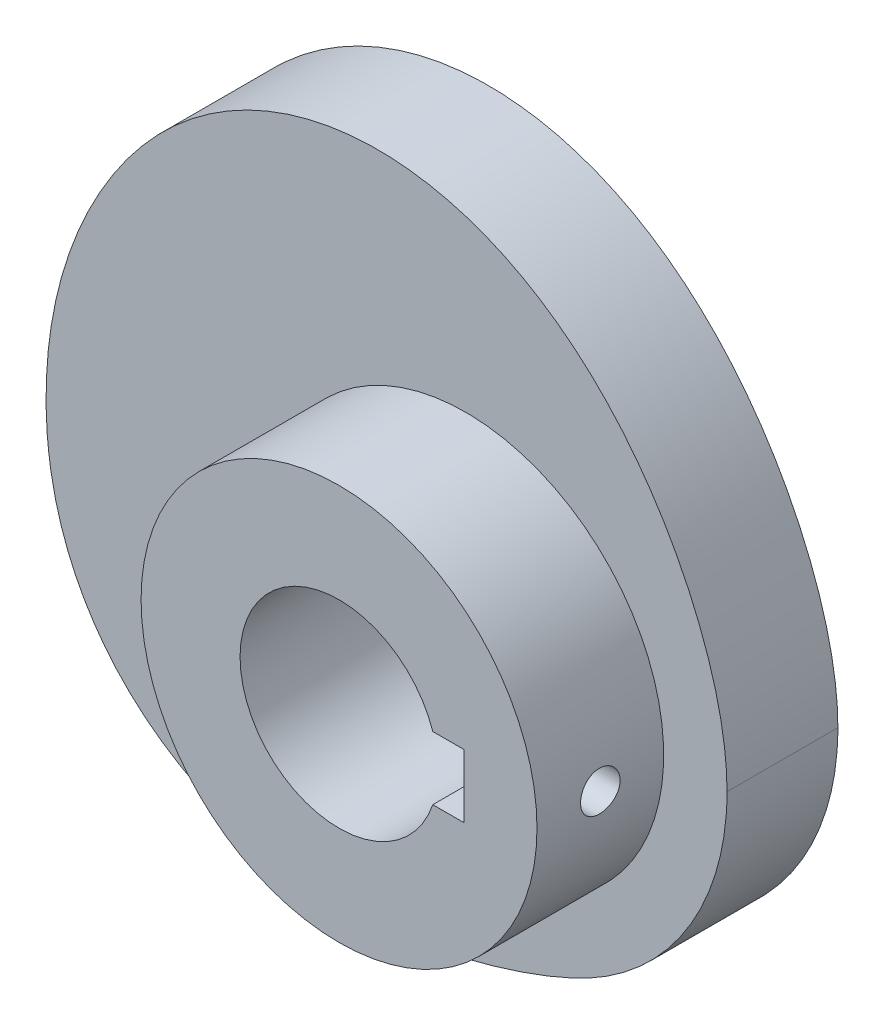
ISO-10303-21;
HEADER;
FILE_DESCRIPTION(('STEP AP214'),'2;1');
FILE_NAME('part.step','',(''),(''),'','','');
FILE_SCHEMA(('AUTOMOTIVE_DESIGN { 1 0 10303 214 1 1 1 1 }'));
ENDSEC;
DATA;
#1=APPLICATION_CONTEXT('core data for automotive mechanical design processes');
#2=APPLICATION_PROTOCOL_DEFINITION('international standard','automotive_design',2000,#1);
#3=PRODUCT_CONTEXT('',#1,'mechanical');
#4=PRODUCT('Part','Part','',(#3));
#5=PRODUCT_RELATED_PRODUCT_CATEGORY('part','',(#4));
#6=PRODUCT_DEFINITION_FORMATION('','',#4);
#7=PRODUCT_DEFINITION_CONTEXT('part definition',#1,'design');
#8=PRODUCT_DEFINITION('design','',#6,#7);
#9=PRODUCT_DEFINITION_SHAPE('','',#8);
#10=(LENGTH_UNIT() NAMED_UNIT(*) SI_UNIT(.MILLI.,.METRE.));
#11=(NAMED_UNIT(*) PLANE_ANGLE_UNIT() SI_UNIT($,.RADIAN.));
#12=(NAMED_UNIT(*) SI_UNIT($,.STERADIAN.) SOLID_ANGLE_UNIT());
#13=UNCERTAINTY_MEASURE_WITH_UNIT(LENGTH_MEASURE(1.E-05),#10,'distance_accuracy_value','');
#14=(GEOMETRIC_REPRESENTATION_CONTEXT(3) GLOBAL_UNCERTAINTY_ASSIGNED_CONTEXT((#13)) GLOBAL_UNIT_ASSIGNED_CONTEXT((#10,
#11,#12)) REPRESENTATION_CONTEXT('',''));
#15=CARTESIAN_POINT('',(0.,0.,0.));
#16=DIRECTION('',(0.,0.,1.));
#17=DIRECTION('',(1.,0.,0.));
#18=AXIS2_PLACEMENT_3D('',#15,#16,#17);
#19=CARTESIAN_POINT('',(-7.3709605697285,-36.2111945327901,0.));
#20=DIRECTION('',(0.,0.,-1.));
#21=DIRECTION('',(-1.,0.,0.));
#22=AXIS2_PLACEMENT_3D('',#19,#20,#21);
#23=PLANE('',#22);
#24=CARTESIAN_POINT('',(-52.399929,-7.544148,0.));
#25=CARTESIAN_POINT('',(-52.2514475105252,-8.34444993274773,0.));
#26=CARTESIAN_POINT('',(-51.9564778908329,-9.93430977033862,0.));
#27=CARTESIAN_POINT('',(-51.4313788468868,-11.8813277428217,0.));
#28=CARTESIAN_POINT('',(-50.9466154916934,-13.4023526014832,0.));
#29=CARTESIAN_POINT('',(-50.5477748516514,-14.5208330980917,0.));
#30=CARTESIAN_POINT('',(-50.1139687547772,-15.6197210397756,0.));
#31=CARTESIAN_POINT('',(-49.6452109087246,-16.6981580375907,0.));
#32=CARTESIAN_POINT('',(-49.1419760694463,-17.7553100378557,0.));
#33=CARTESIAN_POINT('',(-48.604716765922,-18.7903201751489,0.));
#34=CARTESIAN_POINT('',(-48.0339937159755,-19.8023333896151,0.));
#35=CARTESIAN_POINT('',(-47.4304346872806,-20.790495874816,0.));
#36=CARTESIAN_POINT('',(-46.7947376459225,-21.753963168475,0.));
#37=CARTESIAN_POINT('',(-46.1276814352763,-22.6919050329283,0.));
#38=CARTESIAN_POINT('',(-45.4300911184589,-23.6035271118136,0.));
#39=CARTESIAN_POINT('',(-44.4616904607917,-24.7814267497654,0.));
#40=CARTESIAN_POINT('',(-43.1792408584717,-26.1849802534775,0.));
#41=CARTESIAN_POINT('',(-41.5325691306829,-27.7538647036069,0.));
#42=CARTESIAN_POINT('',(-39.7889364746683,-29.2010855332149,0.));
#43=CARTESIAN_POINT('',(-37.9582781497699,-30.5228757176791,0.));
#44=CARTESIAN_POINT('',(-36.0509365120843,-31.7165854933599,0.));
#45=CARTESIAN_POINT('',(-34.0775534876366,-32.780697634572,0.));
#46=CARTESIAN_POINT('',(-32.0488345275358,-33.7148861607282,0.));
#47=CARTESIAN_POINT('',(-29.9753507062401,-34.5200367758683,0.));
#48=CARTESIAN_POINT('',(-27.8673264161743,-35.1982234795106,0.));
#49=CARTESIAN_POINT('',(-25.734442746563,-35.7526536333091,0.));
#50=CARTESIAN_POINT('',(-23.5856591141531,-36.1875740885093,0.));
#51=CARTESIAN_POINT('',(-21.4290633552693,-36.5081496797175,0.));
#52=CARTESIAN_POINT('',(-19.2717600199635,-36.7203102461087,0.));
#53=CARTESIAN_POINT('',(-17.1198042458267,-36.8305950850238,0.));
#54=CARTESIAN_POINT('',(-14.9781860025853,-36.8459709492699,0.));
#55=CARTESIAN_POINT('',(-12.8508731130897,-36.7736547047701,0.));
#56=CARTESIAN_POINT('',(-10.7409136872376,-36.6209379222022,0.));
#57=CARTESIAN_POINT('',(-8.65059787497186,-36.3950225263771,0.));
#58=CARTESIAN_POINT('',(-6.58167452531198,-36.1028634074745,0.));
#59=CARTESIAN_POINT('',(-4.53561116103457,-35.7510269365169,0.));
#60=CARTESIAN_POINT('',(-2.51388778578776,-35.3455562085219,0.));
#61=CARTESIAN_POINT('',(-0.518293787750499,-34.8918561153713,0.));
#62=CARTESIAN_POINT('',(1.44878186282285,-34.3945747382762,0.));
#63=CARTESIAN_POINT('',(3.38410573816377,-33.8575306418036,0.));
#64=CARTESIAN_POINT('',(5.28339500359813,-33.2836372077604,0.));
#65=CARTESIAN_POINT('',(7.14118101365087,-32.6749149201344,0.));
#66=CARTESIAN_POINT('',(8.95071741622066,-32.032560930042,0.));
#67=CARTESIAN_POINT('',(10.7039161524053,-31.3571159996698,0.));
#68=CARTESIAN_POINT('',(12.3913317007457,-30.6488176191115,0.));
#69=CARTESIAN_POINT('',(14.0020489834808,-29.9079007921815,0.));
#70=CARTESIAN_POINT('',(15.5253407930936,-29.1349726367089,0.));
#71=CARTESIAN_POINT('',(16.9672037514807,-28.3198205671357,0.));
#72=CARTESIAN_POINT('',(18.3411570367744,-27.4494701693589,0.));
#73=CARTESIAN_POINT('',(19.6659802564212,-26.5165088193859,0.));
#74=CARTESIAN_POINT('',(20.9433852447628,-25.5195875695659,0.));
#75=CARTESIAN_POINT('',(22.1703480278543,-24.4612098855664,0.));
#76=CARTESIAN_POINT('',(23.3438967409941,-23.3438966213059,0.));
#77=CARTESIAN_POINT('',(24.4612089941291,-22.1703476151702,0.));
#78=CARTESIAN_POINT('',(25.519591015629,-20.9433870151886,0.));
#79=CARTESIAN_POINT('',(26.5164959265808,-19.6659735874071,0.));
#80=CARTESIAN_POINT('',(27.4495182945047,-18.3411819423989,0.));
#81=CARTESIAN_POINT('',(28.3164137181112,-16.9722053880566,0.));
#82=CARTESIAN_POINT('',(29.1150918845648,-15.5623407773047,0.));
#83=CARTESIAN_POINT('',(29.8436298075349,-14.1149852633222,0.));
#84=CARTESIAN_POINT('',(30.500271052329,-12.6336258061601,0.));
#85=CARTESIAN_POINT('',(31.0834356359445,-11.1218303478384,0.));
#86=CARTESIAN_POINT('',(31.5917106706689,-9.58324206066438,0.));
#87=CARTESIAN_POINT('',(32.0239072963333,-8.02156668773274,0.));
#88=CARTESIAN_POINT('',(32.3788462204823,-6.44056684745865,0.));
#89=CARTESIAN_POINT('',(32.656192001709,-4.84405103209897,0.));
#90=CARTESIAN_POINT('',(32.8533357710145,-3.23586501967468,0.));
#91=CARTESIAN_POINT('',(32.9770410385672,-1.61988369496301,0.));
#92=CARTESIAN_POINT('',(32.9923470142199,-0.539961135406717,0.));
#93=CARTESIAN_POINT('',(33.,0.,0.));
#94=B_SPLINE_CURVE_WITH_KNOTS('',3,(#24,#25,#26,#27,#28,#29,#30,#31,#32,#33,#34,#35,#36,#37,#38,
#39,#40,#41,#42,#43,#44,#45,#46,#47,#48,#49,#50,#51,#52,#53,#54,#55,#56,#57,#58,#59,#60,#61,#62,
#63,#64,#65,#66,#67,#68,#69,#70,#71,#72,#73,#74,#75,#76,#77,#78,#79,#80,#81,#82,#83,#84,#85,#86,
#87,#88,#89,#90,#91,#92,#93),.UNSPECIFIED.,.F.,.F.,(4,1,1,1,1,1,1,1,1,1,1,1,1,1,1,1,1,1,1,1,1,1,
1,1,1,1,1,1,1,1,1,1,1,1,1,1,1,1,1,1,1,1,1,1,1,1,1,1,1,1,1,1,1,1,1,1,1,1,1,1,1,1,1,1,1,1,1,4),
(0.,0.0204310052905284,0.0405877249871108,0.0505769235995458,0.0605118336617896,
0.0703966378308255,0.0802352604079824,0.0900313896285036,0.0997884577651051,0.109509647973741,
0.119197921479242,0.128855969425794,0.138486253667606,0.148090969853734,0.157672095642634,
0.176767364487178,0.195785951979742,0.214735199272307,0.233619037277847,0.252438345017876,
0.271191379285144,0.289874287877252,0.308481685082968,0.32700723462912,0.345444275099954,
0.363786424566475,0.382028050563785,0.400164732324535,0.418193504501655,0.436112913315816,
0.453922863180076,0.471624129601219,0.489217592719754,0.50670320983281,0.524078704564042,
0.541338169501439,0.558470582143233,0.575458640985121,0.592277780857604,0.608895690279226,
0.625272245009608,0.641359738013319,0.657103166823467,0.672440382324116,0.687301883151117,
0.701610050819121,0.715317717977019,0.728874016687316,0.742430310316761,0.755986609616847,
0.769542915373352,0.783099210976352,0.796655506579353,0.810211812335858,0.823768111635944,
0.837324405265389,0.850880703975685,0.864437010462782,0.877993308216006,0.891549609268548,
0.905105905996803,0.918662206973544,0.932218502327097,0.945774799278911,0.959331099436062,
0.972887398362099,0.986443702805647,1.),.UNSPECIFIED.);
#95=CARTESIAN_POINT('',(-52.399929,-7.544148,0.));
#96=VERTEX_POINT('',#95);
#97=CARTESIAN_POINT('',(33.,0.,0.));
#98=VERTEX_POINT('',#97);
#99=EDGE_CURVE('E100',#96,#98,#94,.T.);
#100=ORIENTED_EDGE('',*,*,#99,.F.);
#101=CARTESIAN_POINT('',(33.,0.,0.));
#102=CARTESIAN_POINT('',(32.9922048946485,0.544666729046652,0.));
#103=CARTESIAN_POINT('',(32.9764801091663,1.64340331915968,0.));
#104=CARTESIAN_POINT('',(32.8530649306331,3.30172776452317,0.));
#105=CARTESIAN_POINT('',(32.6589154263733,4.9808796951582,0.));
#106=CARTESIAN_POINT('',(32.388196689373,6.67753771541306,0.));
#107=CARTESIAN_POINT('',(32.0449449579297,8.38860626844037,0.));
#108=CARTESIAN_POINT('',(31.6305705651815,10.1111652526951,0.));
#109=CARTESIAN_POINT('',(31.1471867941059,11.8424339645254,0.));
#110=CARTESIAN_POINT('',(30.5965689377242,13.5797136101009,0.));
#111=CARTESIAN_POINT('',(29.9803334404233,15.320337012752,0.));
#112=CARTESIAN_POINT('',(29.299789777072,17.0616151467004,0.));
#113=CARTESIAN_POINT('',(28.5558870288939,18.8007845350163,0.));
#114=CARTESIAN_POINT('',(27.7491736463447,20.5349672310903,0.));
#115=CARTESIAN_POINT('',(26.8797512282361,22.2611199573668,0.));
#116=CARTESIAN_POINT('',(25.9472865942349,23.9760011444517,0.));
#117=CARTESIAN_POINT('',(24.9510204706949,25.6761250728864,0.));
#118=CARTESIAN_POINT('',(23.8898146794508,27.3577205899862,0.));
#119=CARTESIAN_POINT('',(22.7622230087044,29.0166885580506,0.));
#120=CARTESIAN_POINT('',(21.5665863121022,30.6485650239307,0.));
#121=CARTESIAN_POINT('',(20.3011381921013,32.2484791610849,0.));
#122=CARTESIAN_POINT('',(18.9641275552774,33.8111260897613,0.));
#123=CARTESIAN_POINT('',(17.553956128678,35.3307542318085,0.));
#124=CARTESIAN_POINT('',(16.0693067955602,36.8011629626029,0.));
#125=CARTESIAN_POINT('',(14.5092732484042,38.2157223028855,0.));
#126=CARTESIAN_POINT('',(12.8734844170206,39.5674162249032,0.));
#127=CARTESIAN_POINT('',(11.1622070452529,40.8488982924036,0.));
#128=CARTESIAN_POINT('',(9.37644101458905,42.0525782259639,0.));
#129=CARTESIAN_POINT('',(7.51798650469914,43.1707177122414,0.));
#130=CARTESIAN_POINT('',(5.58949009132834,44.1955392175966,0.));
#131=CARTESIAN_POINT('',(3.59446974395924,45.1193462784783,0.));
#132=CARTESIAN_POINT('',(1.53731503959414,45.9346461532363,0.));
#133=CARTESIAN_POINT('',(-0.576735961166601,46.6342766160298,0.));
#134=CARTESIAN_POINT('',(-2.74164202960741,47.2115180413351,0.));
#135=CARTESIAN_POINT('',(-4.95061971646932,47.660204084141,0.));
#136=CARTESIAN_POINT('',(-7.19621985087715,47.9748282877465,0.));
#137=CARTESIAN_POINT('',(-9.47042257050404,48.1506074874805,0.));
#138=CARTESIAN_POINT('',(-11.7647325901411,48.1835801166121,0.));
#139=CARTESIAN_POINT('',(-14.0702887607961,48.0706298683776,0.));
#140=CARTESIAN_POINT('',(-16.3779713660334,47.8095476953185,0.));
#141=CARTESIAN_POINT('',(-18.6785156202073,47.3990406829669,0.));
#142=CARTESIAN_POINT('',(-20.962621159954,46.8387423410924,0.));
#143=CARTESIAN_POINT('',(-23.2210640880899,46.1292135700343,0.));
#144=CARTESIAN_POINT('',(-25.4448007350218,45.2719129760175,0.));
#145=CARTESIAN_POINT('',(-27.6250720879719,44.2691707411963,0.));
#146=CARTESIAN_POINT('',(-29.7535027842498,43.1241464764289,0.));
#147=CARTESIAN_POINT('',(-31.8221868890654,41.8407592466833,0.));
#148=CARTESIAN_POINT('',(-33.8237755684201,40.4236308115512,0.));
#149=CARTESIAN_POINT('',(-35.7515436219792,38.8779942027453,0.));
#150=CARTESIAN_POINT('',(-37.59945619444,37.2096130129625,0.));
#151=CARTESIAN_POINT('',(-39.3622012773794,35.4246682347376,0.));
#152=CARTESIAN_POINT('',(-41.0352318521169,33.5296682357434,0.));
#153=CARTESIAN_POINT('',(-42.6147541994885,31.5313251705,0.));
#154=CARTESIAN_POINT('',(-44.0977744603064,29.4364797732438,0.));
#155=CARTESIAN_POINT('',(-45.4810856457267,27.2531157280869,0.));
#156=CARTESIAN_POINT('',(-46.7607217857399,24.9937143855468,0.));
#157=CARTESIAN_POINT('',(-47.930689696496,22.6695288182377,0.));
#158=CARTESIAN_POINT('',(-48.9852802320343,20.2903669622544,0.));
#159=CARTESIAN_POINT('',(-49.9218797440146,17.8623344402825,0.));
#160=CARTESIAN_POINT('',(-50.7382105600418,15.3912679470886,0.));
#161=CARTESIAN_POINT('',(-51.4323058123817,12.8831224003973,0.));
#162=CARTESIAN_POINT('',(-52.0025027661535,10.3439401592922,0.));
#163=CARTESIAN_POINT('',(-52.447402955246,7.77983984157181,0.));
#164=CARTESIAN_POINT('',(-52.7660154379221,5.19699033367294,0.));
#165=CARTESIAN_POINT('',(-52.9572810792559,2.60164893593507,0.));
#166=CARTESIAN_POINT('',(-53.0215847890695,0.00918824092940842,0.));
#167=CARTESIAN_POINT('',(-52.9568230895677,-2.55676280810381,0.));
#168=CARTESIAN_POINT('',(-52.7687522955947,-5.07709639833477,0.));
#169=CARTESIAN_POINT('',(-52.5221486920646,-6.72662293945106,0.));
#170=CARTESIAN_POINT('',(-52.399929,-7.544148,0.));
#171=B_SPLINE_CURVE_WITH_KNOTS('',3,(#101,#102,#103,#104,#105,#106,#107,#108,#109,#110,#111,
#112,#113,#114,#115,#116,#117,#118,#119,#120,#121,#122,#123,#124,#125,#126,#127,#128,#129,#130,
#131,#132,#133,#134,#135,#136,#137,#138,#139,#140,#141,#142,#143,#144,#145,#146,#147,#148,#149,
#150,#151,#152,#153,#154,#155,#156,#157,#158,#159,#160,#161,#162,#163,#164,#165,#166,#167,#168,
#169,#170),.UNSPECIFIED.,.F.,.F.,(4,1,1,1,1,1,1,1,1,1,1,1,1,1,1,1,1,1,1,1,1,1,1,1,1,1,1,1,1,1,1,
1,1,1,1,1,1,1,1,1,1,1,1,1,1,1,1,1,1,1,1,1,1,1,1,1,1,1,1,1,1,1,1,1,1,1,1,4),(0.,
0.0108956284816561,0.0219793592056323,0.033249846834979,0.0447048429087487,0.0563412037631516,
0.0681549123715956,0.0801410858439984,0.0922941038776744,0.104607701381199,0.117075190108596,
0.12968970706609,0.142444470049885,0.155333078086581,0.168349761653231,0.181489544583039,
0.194748368860621,0.208123105489912,0.221611441005082,0.235211791963207,0.248923031658784,
0.262744319661291,0.276674884852018,0.290713818728176,0.304859986564235,0.319111923353787,
0.333467807804123,0.347925543480599,0.36248282913616,0.377137264014282,0.39188652074094,
0.406728483721188,0.421661422622305,0.436684101749088,0.451795886352839,0.466996828638088,
0.48228771863091,0.497670024917116,0.513145895048388,0.528718049350501,0.544389670426663,
0.560164276677938,0.576045575953094,0.59203730240473,0.608143104008452,0.624366386625441,
0.640710242327591,0.657177352947632,0.673769958419212,0.690489849343879,0.7073383695005,
0.724316457618317,0.741424726517876,0.758663495688188,0.776003856195333,0.79335147379531,
0.810699088486524,0.828046706658569,0.84539432268942,0.862741936037148,0.88008955708528,
0.897437174187582,0.914784793307287,0.932132405109597,0.949480023648031,0.966642525622319,
0.98346763717914,1.),.UNSPECIFIED.);
#172=EDGE_CURVE('E88',#98,#96,#171,.T.);
#173=ORIENTED_EDGE('',*,*,#172,.F.);
#174=EDGE_LOOP('',(#100,#173));
#175=FACE_BOUND('',#174,.T.);
#176=CARTESIAN_POINT('',(0.,0.,0.));
#177=DIRECTION('',(0.,0.,1.));
#178=DIRECTION('',(1.,0.,0.));
#179=AXIS2_PLACEMENT_3D('',#176,#177,#178);
#180=CIRCLE('',#179,12.5);
#181=CARTESIAN_POINT('',(11.842719282327,4.,0.));
#182=VERTEX_POINT('',#181);
#183=CARTESIAN_POINT('',(11.842719282327,-4.,0.));
#184=VERTEX_POINT('',#183);
#185=EDGE_CURVE('E113',#182,#184,#180,.T.);
#186=ORIENTED_EDGE('',*,*,#185,.T.);
#187=DIRECTION('',(1.,0.,0.));
#188=VECTOR('',#187,1.);
#189=CARTESIAN_POINT('',(0.,-4.,0.));
#190=LINE('',#189,#188);
#191=CARTESIAN_POINT('',(15.8,-4.,0.));
#192=VERTEX_POINT('',#191);
#193=EDGE_CURVE('E162',#184,#192,#190,.T.);
#194=ORIENTED_EDGE('',*,*,#193,.T.);
#195=DIRECTION('',(0.,1.,0.));
#196=VECTOR('',#195,1.);
#197=CARTESIAN_POINT('',(15.8,-4.,0.));
#198=LINE('',#197,#196);
#199=CARTESIAN_POINT('',(15.8,4.,0.));
#200=VERTEX_POINT('',#199);
#201=EDGE_CURVE('E166',#192,#200,#198,.T.);
#202=ORIENTED_EDGE('',*,*,#201,.T.);
#203=DIRECTION('',(-1.,0.,0.));
#204=VECTOR('',#203,1.);
#205=CARTESIAN_POINT('',(15.8,4.,0.));
#206=LINE('',#205,#204);
#207=EDGE_CURVE('E163',#200,#182,#206,.T.);
#208=ORIENTED_EDGE('',*,*,#207,.T.);
#209=EDGE_LOOP('',(#186,#194,#202,#208));
#210=FACE_BOUND('',#209,.T.);
#211=ADVANCED_FACE('F51',(#175,#210),#23,.T.);
#212=CARTESIAN_POINT('',(0.,0.,30.));
#213=DIRECTION('',(0.,0.,1.));
#214=DIRECTION('',(1.,0.,0.));
#215=AXIS2_PLACEMENT_3D('',#212,#213,#214);
#216=PLANE('',#215);
#217=CARTESIAN_POINT('',(0.,0.,30.));
#218=DIRECTION('',(0.,0.,1.));
#219=DIRECTION('',(1.,0.,0.));
#220=AXIS2_PLACEMENT_3D('',#217,#218,#219);
#221=CIRCLE('',#220,25.);
#222=CARTESIAN_POINT('',(25.,0.,30.));
#223=VERTEX_POINT('',#222);
#224=EDGE_CURVE('E107',#223,#223,#221,.T.);
#225=ORIENTED_EDGE('',*,*,#224,.T.);
#226=EDGE_LOOP('',(#225));
#227=FACE_BOUND('',#226,.T.);
#228=DIRECTION('',(0.,1.,0.));
#229=VECTOR('',#228,1.);
#230=CARTESIAN_POINT('',(15.8,-4.,30.));
#231=LINE('',#230,#229);
#232=CARTESIAN_POINT('',(15.8,-4.,30.));
#233=VERTEX_POINT('',#232);
#234=CARTESIAN_POINT('',(15.8,4.,30.));
#235=VERTEX_POINT('',#234);
#236=EDGE_CURVE('E170',#233,#235,#231,.T.);
#237=ORIENTED_EDGE('',*,*,#236,.F.);
#238=DIRECTION('',(1.,0.,0.));
#239=VECTOR('',#238,1.);
#240=CARTESIAN_POINT('',(0.,-4.,30.));
#241=LINE('',#240,#239);
#242=CARTESIAN_POINT('',(11.842719282327,-4.,30.));
#243=VERTEX_POINT('',#242);
#244=EDGE_CURVE('E165',#243,#233,#241,.T.);
#245=ORIENTED_EDGE('',*,*,#244,.F.);
#246=CARTESIAN_POINT('',(0.,0.,30.));
#247=DIRECTION('',(0.,0.,1.));
#248=DIRECTION('',(1.,0.,0.));
#249=AXIS2_PLACEMENT_3D('',#246,#247,#248);
#250=CIRCLE('',#249,12.5);
#251=CARTESIAN_POINT('',(11.842719282327,4.,30.));
#252=VERTEX_POINT('',#251);
#253=EDGE_CURVE('E175',#252,#243,#250,.T.);
#254=ORIENTED_EDGE('',*,*,#253,.F.);
#255=DIRECTION('',(-1.,0.,0.));
#256=VECTOR('',#255,1.);
#257=CARTESIAN_POINT('',(15.8,4.,30.));
#258=LINE('',#257,#256);
#259=EDGE_CURVE('E68',#235,#252,#258,.T.);
#260=ORIENTED_EDGE('',*,*,#259,.F.);
#261=EDGE_LOOP('',(#237,#245,#254,#260));
#262=FACE_BOUND('',#261,.T.);
#263=ADVANCED_FACE('F202',(#227,#262),#216,.T.);
#264=CARTESIAN_POINT('',(0.,0.,0.));
#265=DIRECTION('',(0.,0.,1.));
#266=DIRECTION('',(1.,0.,0.));
#267=AXIS2_PLACEMENT_3D('',#264,#265,#266);
#268=CYLINDRICAL_SURFACE('',#267,12.5);
#269=DIRECTION('',(0.,0.,1.));
#270=VECTOR('',#269,1.);
#271=CARTESIAN_POINT('',(11.842719282327,-4.,0.));
#272=LINE('',#271,#270);
#273=EDGE_CURVE('E12',#184,#243,#272,.T.);
#274=ORIENTED_EDGE('',*,*,#273,.F.);
#275=ORIENTED_EDGE('',*,*,#185,.F.);
#276=DIRECTION('',(0.,0.,1.));
#277=VECTOR('',#276,1.);
#278=CARTESIAN_POINT('',(11.842719282327,4.,0.));
#279=LINE('',#278,#277);
#280=EDGE_CURVE('E61',#252,#182,#279,.F.);
#281=ORIENTED_EDGE('',*,*,#280,.F.);
#282=ORIENTED_EDGE('',*,*,#253,.T.);
#283=EDGE_LOOP('',(#274,#275,#281,#282));
#284=FACE_BOUND('',#283,.T.);
#285=ADVANCED_FACE('F197',(#284),#268,.F.);
#286=CARTESIAN_POINT('',(0.,0.,22.));
#287=DIRECTION('',(1.,0.,0.));
#288=DIRECTION('',(0.,0.,-1.));
#289=AXIS2_PLACEMENT_3D('',#286,#287,#288);
#290=CYLINDRICAL_SURFACE('',#289,2.5);
#291=CARTESIAN_POINT('',(25.,0.,19.5));
#292=CARTESIAN_POINT('',(24.9999983880192,-0.140050884478893,19.5000060647509));
#293=CARTESIAN_POINT('',(24.9988106399051,-0.280194362919433,19.5118081722411));
#294=CARTESIAN_POINT('',(24.9941866898684,-0.556595996242092,19.5587109257261));
#295=CARTESIAN_POINT('',(24.9907480108506,-0.69284969792207,19.5938372400615));
#296=CARTESIAN_POINT('',(24.9820103640768,-0.957429188633535,19.6863556014946));
#297=CARTESIAN_POINT('',(24.9767125200177,-1.08575971153727,19.7437342012962));
#298=CARTESIAN_POINT('',(24.9648489348577,-1.33094040240101,19.8791022698291));
#299=CARTESIAN_POINT('',(24.9582834459533,-1.44779284694769,19.9570876400003));
#300=CARTESIAN_POINT('',(24.9445936085331,-1.6671488766852,20.1317567441557));
#301=CARTESIAN_POINT('',(24.9374675393466,-1.76960536208723,20.2284994985051));
#302=CARTESIAN_POINT('',(24.9234739226566,-1.95685630357746,20.4378113356576));
#303=CARTESIAN_POINT('',(24.9166063871229,-2.04164994270663,20.550381150106));
#304=CARTESIAN_POINT('',(24.9038897888196,-2.19133492610904,20.7884463292091));
#305=CARTESIAN_POINT('',(24.8980429177726,-2.2561836636372,20.9139686102371));
#306=CARTESIAN_POINT('',(24.8880509386631,-2.3638659618569,21.1741889647625));
#307=CARTESIAN_POINT('',(24.8839057885556,-2.40670006647823,21.3088868114599));
#308=CARTESIAN_POINT('',(24.8778021018244,-2.46899760400473,21.583154502165));
#309=CARTESIAN_POINT('',(24.8758362599524,-2.48853913250949,21.7227064421305));
#310=CARTESIAN_POINT('',(24.8742910765131,-2.5039382128384,22.0031221584895));
#311=CARTESIAN_POINT('',(24.8747116722186,-2.499796387177,22.1439859003052));
#312=CARTESIAN_POINT('',(24.8778851724734,-2.46801070063169,22.4224882742333));
#313=CARTESIAN_POINT('',(24.8806296147663,-2.44045211031138,22.5601367483217));
#314=CARTESIAN_POINT('',(24.8881283571855,-2.36274786037646,22.8288449080027));
#315=CARTESIAN_POINT('',(24.8928826844623,-2.31260189563936,22.9599045045626));
#316=CARTESIAN_POINT('',(24.9038752363018,-2.19105223470377,23.2119839682472));
#317=CARTESIAN_POINT('',(24.9101160977039,-2.11961070679994,23.3329854737233));
#318=CARTESIAN_POINT('',(24.923376293322,-1.95752506838306,23.5613130372797));
#319=CARTESIAN_POINT('',(24.9303956503196,-1.86688039584126,23.6686386949544));
#320=CARTESIAN_POINT('',(24.9444596328247,-1.66848528103017,23.8670634849726));
#321=CARTESIAN_POINT('',(24.9515042333249,-1.56066119712841,23.958089004702));
#322=CARTESIAN_POINT('',(24.964795726963,-1.33122370434278,24.120759082276));
#323=CARTESIAN_POINT('',(24.9710426192064,-1.209610279999,24.1924036183912));
#324=CARTESIAN_POINT('',(24.9820368916774,-0.95599526423091,24.3142750507756));
#325=CARTESIAN_POINT('',(24.9867840103692,-0.823991865974757,24.3644982120452));
#326=CARTESIAN_POINT('',(24.9942411860352,-0.55336804332483,24.4420472917794));
#327=CARTESIAN_POINT('',(24.9969513039266,-0.4147478169415,24.4693738949766));
#328=CARTESIAN_POINT('',(25.0000212917078,-0.135462747729758,24.5002607693369));
#329=CARTESIAN_POINT('',(25.0003912066934,0.00519075526373076,24.5039226206312));
#330=CARTESIAN_POINT('',(24.9987660439199,0.28510948328925,24.4876428423781));
#331=CARTESIAN_POINT('',(24.9967709981117,0.424374727051175,24.4677015317118));
#332=CARTESIAN_POINT('',(24.9906465384799,0.697270517086685,24.4048657614461));
#333=CARTESIAN_POINT('',(24.986521547951,0.830912122430045,24.362018863805));
#334=CARTESIAN_POINT('',(24.9765999715152,1.08911080345945,24.2546370649068));
#335=CARTESIAN_POINT('',(24.9708033481313,1.21366767539279,24.1901016774015));
#336=CARTESIAN_POINT('',(24.9581618832606,1.45062045043035,24.0409229033402));
#337=CARTESIAN_POINT('',(24.951313590086,1.56297414937229,23.9562127776855));
#338=CARTESIAN_POINT('',(24.937348321738,1.77190405827969,23.7691848306477));
#339=CARTESIAN_POINT('',(24.9302313398243,1.86847987212294,23.6668665673242));
#340=CARTESIAN_POINT('',(24.9165006035189,2.04346527471786,23.4470835633525));
#341=CARTESIAN_POINT('',(24.9098887534744,2.12180819669886,23.3295656086434));
#342=CARTESIAN_POINT('',(24.8979458115222,2.25764564685957,23.0829815996333));
#343=CARTESIAN_POINT('',(24.8926147021009,2.3151404601347,22.953915703279));
#344=CARTESIAN_POINT('',(24.8838486908512,2.40753802171119,22.6881281513355));
#345=CARTESIAN_POINT('',(24.8804104612447,2.44248043702965,22.5514203997722));
#346=CARTESIAN_POINT('',(24.8758091320719,2.48891001782365,22.2740420050981));
#347=CARTESIAN_POINT('',(24.8746459672546,2.50039785599879,22.1333714757608));
#348=CARTESIAN_POINT('',(24.8747278276891,2.49958284617814,21.8527232791082));
#349=CARTESIAN_POINT('',(24.8759622521752,2.48738472398278,21.712745292793));
#350=CARTESIAN_POINT('',(24.8806775972387,2.43976363240913,21.4368377070793));
#351=CARTESIAN_POINT('',(24.884158520343,2.4043406369054,21.300908112235));
#352=CARTESIAN_POINT('',(24.8929717065797,2.31130421574375,21.0369566273804));
#353=CARTESIAN_POINT('',(24.898303713509,2.25369386085229,20.9089336459257));
#354=CARTESIAN_POINT('',(24.910218795984,2.11792888727761,20.6643577708224));
#355=CARTESIAN_POINT('',(24.9168018645238,2.03977438363853,20.5478048129484));
#356=CARTESIAN_POINT('',(24.9305121802424,1.86474639071333,20.3289408138202));
#357=CARTESIAN_POINT('',(24.9376416181688,1.76779487222567,20.2266923090823));
#358=CARTESIAN_POINT('',(24.9516213682196,1.55807924806278,20.0398694182509));
#359=CARTESIAN_POINT('',(24.9584716130744,1.44531136027064,19.9552992716071));
#360=CARTESIAN_POINT('',(24.971139051729,1.20685358540322,19.8060663653634));
#361=CARTESIAN_POINT('',(24.9769536006703,1.08113187336691,19.741454272637));
#362=CARTESIAN_POINT('',(24.9868657312474,0.820645697751375,19.6343439429403));
#363=CARTESIAN_POINT('',(24.9909652477413,0.685891624564022,19.5918207726161));
#364=CARTESIAN_POINT('',(24.9959553443433,0.45864565351426,19.540698457288));
#365=CARTESIAN_POINT('',(24.9974650172958,0.367606382111272,19.5254573892516));
#366=CARTESIAN_POINT('',(24.9994878737697,0.184391452043282,19.5051061848456));
#367=CARTESIAN_POINT('',(25.0000010614006,0.0922157980663946,19.4999960066953));
#368=CARTESIAN_POINT('',(25.,0.,19.5));
#369=B_SPLINE_CURVE_WITH_KNOTS('',3,(#291,#292,#293,#294,#295,#296,#297,#298,#299,#300,#301,
#302,#303,#304,#305,#306,#307,#308,#309,#310,#311,#312,#313,#314,#315,#316,#317,#318,#319,#320,
#321,#322,#323,#324,#325,#326,#327,#328,#329,#330,#331,#332,#333,#334,#335,#336,#337,#338,#339,
#340,#341,#342,#343,#344,#345,#346,#347,#348,#349,#350,#351,#352,#353,#354,#355,#356,#357,#358,
#359,#360,#361,#362,#363,#364,#365,#366,#367,#368),.UNSPECIFIED.,.T.,.F.,(4,2,2,2,2,2,2,2,2,2,2,
2,2,2,2,2,2,2,2,2,2,2,2,2,2,2,2,2,2,2,2,2,2,2,2,2,2,2,4),(0.,0.419815915671184,
0.840094607088716,1.2601197143305,1.68006134395695,2.10134642155736,2.52265098051764,
2.94484938680555,3.3670373610626,3.78780580112991,4.20856318139441,4.62779493602776,
5.04703235404084,5.46701903432237,5.88701800827813,6.30886835490516,6.73071917449429,
7.15264351733953,7.57455524188598,7.99465471519394,8.41474851297858,8.83397338235761,
9.25320765123667,9.67384851871745,10.0944999452557,10.5166660902149,10.9388264618843,
11.3602422648251,11.7816459809896,12.2011907323489,12.620735955651,13.04022313407,
13.459707963474,13.8809729356913,14.3023388159239,14.724765775656,15.1467148698824,
15.4231416808087,15.6995673517257),.UNSPECIFIED.);
#370=CARTESIAN_POINT('',(25.,0.,19.5));
#371=VERTEX_POINT('',#370);
#372=EDGE_CURVE('E136',#371,#371,#369,.T.);
#373=ORIENTED_EDGE('',*,*,#372,.F.);
#374=EDGE_LOOP('',(#373));
#375=FACE_BOUND('',#374,.T.);
#376=CARTESIAN_POINT('',(15.8,0.,22.));
#377=DIRECTION('',(-1.,0.,0.));
#378=DIRECTION('',(0.,0.,1.));
#379=AXIS2_PLACEMENT_3D('',#376,#377,#378);
#380=CIRCLE('',#379,2.5);
#381=CARTESIAN_POINT('',(15.8,0.,24.5));
#382=VERTEX_POINT('',#381);
#383=EDGE_CURVE('E133',#382,#382,#380,.F.);
#384=ORIENTED_EDGE('',*,*,#383,.F.);
#385=EDGE_LOOP('',(#384));
#386=FACE_BOUND('',#385,.T.);
#387=ADVANCED_FACE('F192',(#375,#386),#290,.F.);
#388=CARTESIAN_POINT('',(-52.399929,-7.544148,14.));
#389=CARTESIAN_POINT('',(-52.2514475105252,-8.34444993274773,14.));
#390=CARTESIAN_POINT('',(-51.9564778908329,-9.93430977033862,14.));
#391=CARTESIAN_POINT('',(-51.4313788468868,-11.8813277428217,14.));
#392=CARTESIAN_POINT('',(-50.9466154916934,-13.4023526014832,14.));
#393=CARTESIAN_POINT('',(-50.5477748516514,-14.5208330980917,14.));
#394=CARTESIAN_POINT('',(-50.1139687547772,-15.6197210397756,14.));
#395=CARTESIAN_POINT('',(-49.6452109087246,-16.6981580375907,14.));
#396=CARTESIAN_POINT('',(-49.1419760694463,-17.7553100378557,14.));
#397=CARTESIAN_POINT('',(-48.604716765922,-18.7903201751489,14.));
#398=CARTESIAN_POINT('',(-48.0339937159755,-19.8023333896151,14.));
#399=CARTESIAN_POINT('',(-47.4304346872806,-20.790495874816,14.));
#400=CARTESIAN_POINT('',(-46.7947376459225,-21.753963168475,14.));
#401=CARTESIAN_POINT('',(-46.1276814352763,-22.6919050329283,14.));
#402=CARTESIAN_POINT('',(-45.4300911184589,-23.6035271118136,14.));
#403=CARTESIAN_POINT('',(-44.4616904607917,-24.7814267497654,14.));
#404=CARTESIAN_POINT('',(-43.1792408584717,-26.1849802534775,14.));
#405=CARTESIAN_POINT('',(-41.5325691306829,-27.7538647036069,14.));
#406=CARTESIAN_POINT('',(-39.7889364746683,-29.2010855332149,14.));
#407=CARTESIAN_POINT('',(-37.9582781497699,-30.5228757176791,14.));
#408=CARTESIAN_POINT('',(-36.0509365120843,-31.7165854933599,14.));
#409=CARTESIAN_POINT('',(-34.0775534876366,-32.780697634572,14.));
#410=CARTESIAN_POINT('',(-32.0488345275358,-33.7148861607282,14.));
#411=CARTESIAN_POINT('',(-29.9753507062401,-34.5200367758683,14.));
#412=CARTESIAN_POINT('',(-27.8673264161743,-35.1982234795106,14.));
#413=CARTESIAN_POINT('',(-25.734442746563,-35.7526536333091,14.));
#414=CARTESIAN_POINT('',(-23.5856591141531,-36.1875740885093,14.));
#415=CARTESIAN_POINT('',(-21.4290633552693,-36.5081496797175,14.));
#416=CARTESIAN_POINT('',(-19.2717600199635,-36.7203102461087,14.));
#417=CARTESIAN_POINT('',(-17.1198042458267,-36.8305950850238,14.));
#418=CARTESIAN_POINT('',(-14.9781860025853,-36.8459709492699,14.));
#419=CARTESIAN_POINT('',(-12.8508731130897,-36.7736547047701,14.));
#420=CARTESIAN_POINT('',(-10.7409136872376,-36.6209379222022,14.));
#421=CARTESIAN_POINT('',(-8.65059787497186,-36.3950225263771,14.));
#422=CARTESIAN_POINT('',(-6.58167452531198,-36.1028634074745,14.));
#423=CARTESIAN_POINT('',(-4.53561116103457,-35.7510269365169,14.));
#424=CARTESIAN_POINT('',(-2.51388778578776,-35.3455562085219,14.));
#425=CARTESIAN_POINT('',(-0.518293787750499,-34.8918561153713,14.));
#426=CARTESIAN_POINT('',(1.44878186282285,-34.3945747382762,14.));
#427=CARTESIAN_POINT('',(3.38410573816377,-33.8575306418036,14.));
#428=CARTESIAN_POINT('',(5.28339500359813,-33.2836372077604,14.));
#429=CARTESIAN_POINT('',(7.14118101365087,-32.6749149201344,14.));
#430=CARTESIAN_POINT('',(8.95071741622066,-32.032560930042,14.));
#431=CARTESIAN_POINT('',(10.7039161524053,-31.3571159996698,14.));
#432=CARTESIAN_POINT('',(12.3913317007457,-30.6488176191115,14.));
#433=CARTESIAN_POINT('',(14.0020489834808,-29.9079007921815,14.));
#434=CARTESIAN_POINT('',(15.5253407930936,-29.1349726367089,14.));
#435=CARTESIAN_POINT('',(16.9672037514807,-28.3198205671357,14.));
#436=CARTESIAN_POINT('',(18.3411570367744,-27.4494701693589,14.));
#437=CARTESIAN_POINT('',(19.6659802564212,-26.5165088193859,14.));
#438=CARTESIAN_POINT('',(20.9433852447628,-25.5195875695659,14.));
#439=CARTESIAN_POINT('',(22.1703480278543,-24.4612098855664,14.));
#440=CARTESIAN_POINT('',(23.3438967409941,-23.3438966213059,14.));
#441=CARTESIAN_POINT('',(24.4612089941291,-22.1703476151702,14.));
#442=CARTESIAN_POINT('',(25.519591015629,-20.9433870151886,14.));
#443=CARTESIAN_POINT('',(26.5164959265808,-19.6659735874071,14.));
#444=CARTESIAN_POINT('',(27.4495182945047,-18.3411819423989,14.));
#445=CARTESIAN_POINT('',(28.3164137181112,-16.9722053880566,14.));
#446=CARTESIAN_POINT('',(29.1150918845648,-15.5623407773047,14.));
#447=CARTESIAN_POINT('',(29.8436298075349,-14.1149852633222,14.));
#448=CARTESIAN_POINT('',(30.500271052329,-12.6336258061601,14.));
#449=CARTESIAN_POINT('',(31.0834356359445,-11.1218303478384,14.));
#450=CARTESIAN_POINT('',(31.5917106706689,-9.58324206066438,14.));
#451=CARTESIAN_POINT('',(32.0239072963333,-8.02156668773274,14.));
#452=CARTESIAN_POINT('',(32.3788462204823,-6.44056684745865,14.));
#453=CARTESIAN_POINT('',(32.656192001709,-4.84405103209897,14.));
#454=CARTESIAN_POINT('',(32.8533357710145,-3.23586501967468,14.));
#455=CARTESIAN_POINT('',(32.9770410385672,-1.61988369496301,14.));
#456=CARTESIAN_POINT('',(32.9923470142199,-0.539961135406717,14.));
#457=CARTESIAN_POINT('',(33.,0.,14.));
#458=B_SPLINE_CURVE_WITH_KNOTS('',3,(#388,#389,#390,#391,#392,#393,#394,#395,#396,#397,#398,
#399,#400,#401,#402,#403,#404,#405,#406,#407,#408,#409,#410,#411,#412,#413,#414,#415,#416,#417,
#418,#419,#420,#421,#422,#423,#424,#425,#426,#427,#428,#429,#430,#431,#432,#433,#434,#435,#436,
#437,#438,#439,#440,#441,#442,#443,#444,#445,#446,#447,#448,#449,#450,#451,#452,#453,#454,#455,
#456,#457),.UNSPECIFIED.,.F.,.F.,(4,1,1,1,1,1,1,1,1,1,1,1,1,1,1,1,1,1,1,1,1,1,1,1,1,1,1,1,1,1,1,
1,1,1,1,1,1,1,1,1,1,1,1,1,1,1,1,1,1,1,1,1,1,1,1,1,1,1,1,1,1,1,1,1,1,1,1,4),(0.,
0.0204310052905284,0.0405877249871108,0.0505769235995458,0.0605118336617896,0.0703966378308255,
0.0802352604079824,0.0900313896285036,0.0997884577651051,0.109509647973741,0.119197921479242,
0.128855969425794,0.138486253667606,0.148090969853734,0.157672095642634,0.176767364487178,
0.195785951979742,0.214735199272307,0.233619037277847,0.252438345017876,0.271191379285144,
0.289874287877252,0.308481685082968,0.32700723462912,0.345444275099954,0.363786424566475,
0.382028050563785,0.400164732324535,0.418193504501655,0.436112913315816,0.453922863180076,
0.471624129601219,0.489217592719754,0.50670320983281,0.524078704564042,0.541338169501439,
0.558470582143233,0.575458640985121,0.592277780857604,0.608895690279226,0.625272245009608,
0.641359738013319,0.657103166823467,0.672440382324116,0.687301883151117,0.701610050819121,
0.715317717977019,0.728874016687316,0.742430310316761,0.755986609616847,0.769542915373352,
0.783099210976352,0.796655506579353,0.810211812335858,0.823768111635944,0.837324405265389,
0.850880703975685,0.864437010462782,0.877993308216006,0.891549609268548,0.905105905996803,
0.918662206973544,0.932218502327097,0.945774799278911,0.959331099436062,0.972887398362099,
0.986443702805647,1.),.UNSPECIFIED.);
#459=DIRECTION('',(0.,0.,-1.));
#460=VECTOR('',#459,1.);
#461=SURFACE_OF_LINEAR_EXTRUSION('',#458,#460);
#462=ORIENTED_EDGE('',*,*,#99,.T.);
#463=DIRECTION('',(0.,0.,-1.));
#464=VECTOR('',#463,1.);
#465=CARTESIAN_POINT('',(33.,0.,14.));
#466=LINE('',#465,#464);
#467=CARTESIAN_POINT('',(33.,0.,14.));
#468=VERTEX_POINT('',#467);
#469=EDGE_CURVE('E94',#468,#98,#466,.T.);
#470=ORIENTED_EDGE('',*,*,#469,.F.);
#471=CARTESIAN_POINT('',(-52.399929,-7.544148,14.));
#472=VERTEX_POINT('',#471);
#473=EDGE_CURVE('E99',#472,#468,#458,.T.);
#474=ORIENTED_EDGE('',*,*,#473,.F.);
#475=DIRECTION('',(0.,0.,-1.));
#476=VECTOR('',#475,1.);
#477=CARTESIAN_POINT('',(-52.399929,-7.544148,14.));
#478=LINE('',#477,#476);
#479=EDGE_CURVE('E91',#472,#96,#478,.T.);
#480=ORIENTED_EDGE('',*,*,#479,.T.);
#481=EDGE_LOOP('',(#462,#470,#474,#480));
#482=FACE_BOUND('',#481,.T.);
#483=ADVANCED_FACE('F53',(#482),#461,.F.);
#484=CARTESIAN_POINT('',(33.,0.,14.));
#485=CARTESIAN_POINT('',(32.9922048946485,0.544666729046652,14.));
#486=CARTESIAN_POINT('',(32.9764801091663,1.64340331915968,14.));
#487=CARTESIAN_POINT('',(32.8530649306331,3.30172776452317,14.));
#488=CARTESIAN_POINT('',(32.6589154263733,4.9808796951582,14.));
#489=CARTESIAN_POINT('',(32.388196689373,6.67753771541306,14.));
#490=CARTESIAN_POINT('',(32.0449449579297,8.38860626844037,14.));
#491=CARTESIAN_POINT('',(31.6305705651815,10.1111652526951,14.));
#492=CARTESIAN_POINT('',(31.1471867941059,11.8424339645254,14.));
#493=CARTESIAN_POINT('',(30.5965689377242,13.5797136101009,14.));
#494=CARTESIAN_POINT('',(29.9803334404233,15.320337012752,14.));
#495=CARTESIAN_POINT('',(29.299789777072,17.0616151467004,14.));
#496=CARTESIAN_POINT('',(28.5558870288939,18.8007845350163,14.));
#497=CARTESIAN_POINT('',(27.7491736463447,20.5349672310903,14.));
#498=CARTESIAN_POINT('',(26.8797512282361,22.2611199573668,14.));
#499=CARTESIAN_POINT('',(25.9472865942349,23.9760011444517,14.));
#500=CARTESIAN_POINT('',(24.9510204706949,25.6761250728864,14.));
#501=CARTESIAN_POINT('',(23.8898146794508,27.3577205899862,14.));
#502=CARTESIAN_POINT('',(22.7622230087044,29.0166885580506,14.));
#503=CARTESIAN_POINT('',(21.5665863121022,30.6485650239307,14.));
#504=CARTESIAN_POINT('',(20.3011381921013,32.2484791610849,14.));
#505=CARTESIAN_POINT('',(18.9641275552774,33.8111260897613,14.));
#506=CARTESIAN_POINT('',(17.553956128678,35.3307542318085,14.));
#507=CARTESIAN_POINT('',(16.0693067955602,36.8011629626029,14.));
#508=CARTESIAN_POINT('',(14.5092732484042,38.2157223028855,14.));
#509=CARTESIAN_POINT('',(12.8734844170206,39.5674162249032,14.));
#510=CARTESIAN_POINT('',(11.1622070452529,40.8488982924036,14.));
#511=CARTESIAN_POINT('',(9.37644101458905,42.0525782259639,14.));
#512=CARTESIAN_POINT('',(7.51798650469914,43.1707177122414,14.));
#513=CARTESIAN_POINT('',(5.58949009132834,44.1955392175966,14.));
#514=CARTESIAN_POINT('',(3.59446974395924,45.1193462784783,14.));
#515=CARTESIAN_POINT('',(1.53731503959414,45.9346461532363,14.));
#516=CARTESIAN_POINT('',(-0.576735961166601,46.6342766160298,14.));
#517=CARTESIAN_POINT('',(-2.74164202960741,47.2115180413351,14.));
#518=CARTESIAN_POINT('',(-4.95061971646932,47.660204084141,14.));
#519=CARTESIAN_POINT('',(-7.19621985087715,47.9748282877465,14.));
#520=CARTESIAN_POINT('',(-9.47042257050404,48.1506074874805,14.));
#521=CARTESIAN_POINT('',(-11.7647325901411,48.1835801166121,14.));
#522=CARTESIAN_POINT('',(-14.0702887607961,48.0706298683776,14.));
#523=CARTESIAN_POINT('',(-16.3779713660334,47.8095476953185,14.));
#524=CARTESIAN_POINT('',(-18.6785156202073,47.3990406829669,14.));
#525=CARTESIAN_POINT('',(-20.962621159954,46.8387423410924,14.));
#526=CARTESIAN_POINT('',(-23.2210640880899,46.1292135700343,14.));
#527=CARTESIAN_POINT('',(-25.4448007350218,45.2719129760175,14.));
#528=CARTESIAN_POINT('',(-27.6250720879719,44.2691707411963,14.));
#529=CARTESIAN_POINT('',(-29.7535027842498,43.1241464764289,14.));
#530=CARTESIAN_POINT('',(-31.8221868890654,41.8407592466833,14.));
#531=CARTESIAN_POINT('',(-33.8237755684201,40.4236308115512,14.));
#532=CARTESIAN_POINT('',(-35.7515436219792,38.8779942027453,14.));
#533=CARTESIAN_POINT('',(-37.59945619444,37.2096130129625,14.));
#534=CARTESIAN_POINT('',(-39.3622012773794,35.4246682347376,14.));
#535=CARTESIAN_POINT('',(-41.0352318521169,33.5296682357434,14.));
#536=CARTESIAN_POINT('',(-42.6147541994885,31.5313251705,14.));
#537=CARTESIAN_POINT('',(-44.0977744603064,29.4364797732438,14.));
#538=CARTESIAN_POINT('',(-45.4810856457267,27.2531157280869,14.));
#539=CARTESIAN_POINT('',(-46.7607217857399,24.9937143855468,14.));
#540=CARTESIAN_POINT('',(-47.930689696496,22.6695288182377,14.));
#541=CARTESIAN_POINT('',(-48.9852802320343,20.2903669622544,14.));
#542=CARTESIAN_POINT('',(-49.9218797440146,17.8623344402825,14.));
#543=CARTESIAN_POINT('',(-50.7382105600418,15.3912679470886,14.));
#544=CARTESIAN_POINT('',(-51.4323058123817,12.8831224003973,14.));
#545=CARTESIAN_POINT('',(-52.0025027661535,10.3439401592922,14.));
#546=CARTESIAN_POINT('',(-52.447402955246,7.77983984157181,14.));
#547=CARTESIAN_POINT('',(-52.7660154379221,5.19699033367294,14.));
#548=CARTESIAN_POINT('',(-52.9572810792559,2.60164893593507,14.));
#549=CARTESIAN_POINT('',(-53.0215847890695,0.00918824092940842,14.));
#550=CARTESIAN_POINT('',(-52.9568230895677,-2.55676280810381,14.));
#551=CARTESIAN_POINT('',(-52.7687522955947,-5.07709639833477,14.));
#552=CARTESIAN_POINT('',(-52.5221486920646,-6.72662293945106,14.));
#553=CARTESIAN_POINT('',(-52.399929,-7.544148,14.));
#554=B_SPLINE_CURVE_WITH_KNOTS('',3,(#484,#485,#486,#487,#488,#489,#490,#491,#492,#493,#494,
#495,#496,#497,#498,#499,#500,#501,#502,#503,#504,#505,#506,#507,#508,#509,#510,#511,#512,#513,
#514,#515,#516,#517,#518,#519,#520,#521,#522,#523,#524,#525,#526,#527,#528,#529,#530,#531,#532,
#533,#534,#535,#536,#537,#538,#539,#540,#541,#542,#543,#544,#545,#546,#547,#548,#549,#550,#551,
#552,#553),.UNSPECIFIED.,.F.,.F.,(4,1,1,1,1,1,1,1,1,1,1,1,1,1,1,1,1,1,1,1,1,1,1,1,1,1,1,1,1,1,1,
1,1,1,1,1,1,1,1,1,1,1,1,1,1,1,1,1,1,1,1,1,1,1,1,1,1,1,1,1,1,1,1,1,1,1,1,4),(0.,
0.0108956284816561,0.0219793592056323,0.033249846834979,0.0447048429087487,0.0563412037631516,
0.0681549123715956,0.0801410858439984,0.0922941038776744,0.104607701381199,0.117075190108596,
0.12968970706609,0.142444470049885,0.155333078086581,0.168349761653231,0.181489544583039,
0.194748368860621,0.208123105489912,0.221611441005082,0.235211791963207,0.248923031658784,
0.262744319661291,0.276674884852018,0.290713818728176,0.304859986564235,0.319111923353787,
0.333467807804123,0.347925543480599,0.36248282913616,0.377137264014282,0.39188652074094,
0.406728483721188,0.421661422622305,0.436684101749088,0.451795886352839,0.466996828638088,
0.48228771863091,0.497670024917116,0.513145895048388,0.528718049350501,0.544389670426663,
0.560164276677938,0.576045575953094,0.59203730240473,0.608143104008452,0.624366386625441,
0.640710242327591,0.657177352947632,0.673769958419212,0.690489849343879,0.7073383695005,
0.724316457618317,0.741424726517876,0.758663495688188,0.776003856195333,0.79335147379531,
0.810699088486524,0.828046706658569,0.84539432268942,0.862741936037148,0.88008955708528,
0.897437174187582,0.914784793307287,0.932132405109597,0.949480023648031,0.966642525622319,
0.98346763717914,1.),.UNSPECIFIED.);
#555=DIRECTION('',(0.,0.,-1.));
#556=VECTOR('',#555,1.);
#557=SURFACE_OF_LINEAR_EXTRUSION('',#554,#556);
#558=ORIENTED_EDGE('',*,*,#172,.T.);
#559=ORIENTED_EDGE('',*,*,#479,.F.);
#560=EDGE_CURVE('E76',#468,#472,#554,.T.);
#561=ORIENTED_EDGE('',*,*,#560,.F.);
#562=ORIENTED_EDGE('',*,*,#469,.T.);
#563=EDGE_LOOP('',(#558,#559,#561,#562));
#564=FACE_BOUND('',#563,.T.);
#565=ADVANCED_FACE('F90',(#564),#557,.F.);
#566=CARTESIAN_POINT('',(-7.3709605697285,-36.2111945327901,14.));
#567=DIRECTION('',(0.,0.,-1.));
#568=DIRECTION('',(-1.,0.,0.));
#569=AXIS2_PLACEMENT_3D('',#566,#567,#568);
#570=PLANE('',#569);
#571=CARTESIAN_POINT('',(0.,0.,14.));
#572=DIRECTION('',(0.,0.,-1.));
#573=DIRECTION('',(-1.,0.,0.));
#574=AXIS2_PLACEMENT_3D('',#571,#572,#573);
#575=CIRCLE('',#574,25.);
#576=CARTESIAN_POINT('',(-25.,0.,14.));
#577=VERTEX_POINT('',#576);
#578=EDGE_CURVE('E132',#577,#577,#575,.F.);
#579=ORIENTED_EDGE('',*,*,#578,.F.);
#580=EDGE_LOOP('',(#579));
#581=FACE_BOUND('',#580,.T.);
#582=ORIENTED_EDGE('',*,*,#473,.T.);
#583=ORIENTED_EDGE('',*,*,#560,.T.);
#584=EDGE_LOOP('',(#582,#583));
#585=FACE_BOUND('',#584,.T.);
#586=ADVANCED_FACE('F252',(#581,#585),#570,.F.);
#587=CARTESIAN_POINT('',(0.,0.,30.));
#588=DIRECTION('',(0.,0.,-1.));
#589=DIRECTION('',(-1.,0.,0.));
#590=AXIS2_PLACEMENT_3D('',#587,#588,#589);
#591=CYLINDRICAL_SURFACE('',#590,25.);
#592=ORIENTED_EDGE('',*,*,#372,.T.);
#593=EDGE_LOOP('',(#592));
#594=FACE_BOUND('',#593,.T.);
#595=ORIENTED_EDGE('',*,*,#224,.F.);
#596=EDGE_LOOP('',(#595));
#597=FACE_BOUND('',#596,.T.);
#598=ORIENTED_EDGE('',*,*,#578,.T.);
#599=EDGE_LOOP('',(#598));
#600=FACE_BOUND('',#599,.T.);
#601=ADVANCED_FACE('F188',(#594,#597,#600),#591,.T.);
#602=CARTESIAN_POINT('',(0.,-4.,30.));
#603=DIRECTION('',(0.,1.,0.));
#604=DIRECTION('',(0.,0.,1.));
#605=AXIS2_PLACEMENT_3D('',#602,#603,#604);
#606=PLANE('',#605);
#607=ORIENTED_EDGE('',*,*,#273,.T.);
#608=ORIENTED_EDGE('',*,*,#244,.T.);
#609=DIRECTION('',(0.,0.,-1.));
#610=VECTOR('',#609,1.);
#611=CARTESIAN_POINT('',(15.8,-4.,30.));
#612=LINE('',#611,#610);
#613=EDGE_CURVE('E137',#233,#192,#612,.T.);
#614=ORIENTED_EDGE('',*,*,#613,.T.);
#615=ORIENTED_EDGE('',*,*,#193,.F.);
#616=EDGE_LOOP('',(#607,#608,#614,#615));
#617=FACE_BOUND('',#616,.T.);
#618=ADVANCED_FACE('F199',(#617),#606,.T.);
#619=CARTESIAN_POINT('',(15.8,4.,30.));
#620=DIRECTION('',(0.,-1.,0.));
#621=DIRECTION('',(0.,0.,-1.));
#622=AXIS2_PLACEMENT_3D('',#619,#620,#621);
#623=PLANE('',#622);
#624=ORIENTED_EDGE('',*,*,#280,.T.);
#625=ORIENTED_EDGE('',*,*,#207,.F.);
#626=DIRECTION('',(0.,0.,-1.));
#627=VECTOR('',#626,1.);
#628=CARTESIAN_POINT('',(15.8,4.,30.));
#629=LINE('',#628,#627);
#630=EDGE_CURVE('E223',#235,#200,#629,.T.);
#631=ORIENTED_EDGE('',*,*,#630,.F.);
#632=ORIENTED_EDGE('',*,*,#259,.T.);
#633=EDGE_LOOP('',(#624,#625,#631,#632));
#634=FACE_BOUND('',#633,.T.);
#635=ADVANCED_FACE('F244',(#634),#623,.T.);
#636=CARTESIAN_POINT('',(15.8,-4.,30.));
#637=DIRECTION('',(-1.,0.,0.));
#638=DIRECTION('',(0.,0.,1.));
#639=AXIS2_PLACEMENT_3D('',#636,#637,#638);
#640=PLANE('',#639);
#641=ORIENTED_EDGE('',*,*,#201,.F.);
#642=ORIENTED_EDGE('',*,*,#613,.F.);
#643=ORIENTED_EDGE('',*,*,#236,.T.);
#644=ORIENTED_EDGE('',*,*,#630,.T.);
#645=EDGE_LOOP('',(#641,#642,#643,#644));
#646=FACE_BOUND('',#645,.T.);
#647=ORIENTED_EDGE('',*,*,#383,.T.);
#648=EDGE_LOOP('',(#647));
#649=FACE_BOUND('',#648,.T.);
#650=ADVANCED_FACE('F236',(#646,#649),#640,.T.);
#651=CLOSED_SHELL('',(#211,#263,#285,#387,#483,#565,#586,#601,#618,#635,#650));
#652=MANIFOLD_SOLID_BREP('B2',#651);
#653=ADVANCED_BREP_SHAPE_REPRESENTATION('',(#18,#652),#14);
#654=SHAPE_DEFINITION_REPRESENTATION(#9,#653);
ENDSEC;
END-ISO-10303-21;
